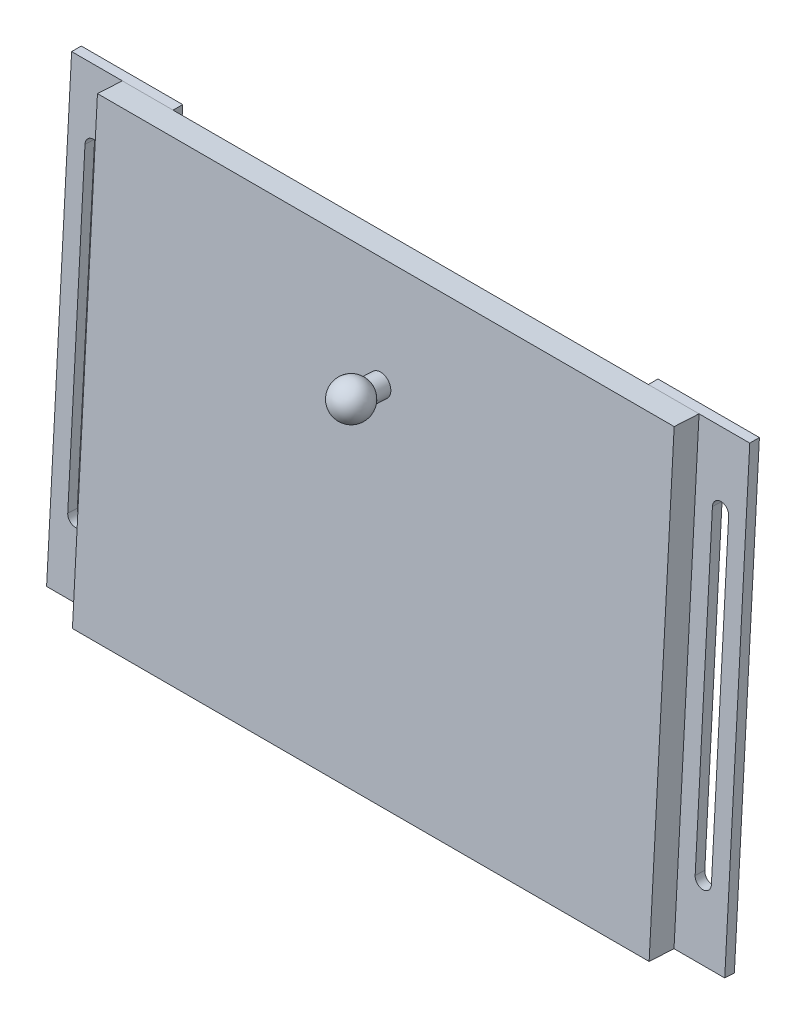
ISO-10303-21;
HEADER;
FILE_DESCRIPTION(('STEP AP214'),'2;1');
FILE_NAME('part.step','',(''),(''),'','','');
FILE_SCHEMA(('AUTOMOTIVE_DESIGN { 1 0 10303 214 1 1 1 1 }'));
ENDSEC;
DATA;
#1=APPLICATION_CONTEXT('core data for automotive mechanical design processes');
#2=APPLICATION_PROTOCOL_DEFINITION('international standard','automotive_design',2000,#1);
#3=PRODUCT_CONTEXT('',#1,'mechanical');
#4=PRODUCT('Part','Part','',(#3));
#5=PRODUCT_RELATED_PRODUCT_CATEGORY('part','',(#4));
#6=PRODUCT_DEFINITION_FORMATION('','',#4);
#7=PRODUCT_DEFINITION_CONTEXT('part definition',#1,'design');
#8=PRODUCT_DEFINITION('design','',#6,#7);
#9=PRODUCT_DEFINITION_SHAPE('','',#8);
#10=(LENGTH_UNIT() NAMED_UNIT(*) SI_UNIT(.MILLI.,.METRE.));
#11=(NAMED_UNIT(*) PLANE_ANGLE_UNIT() SI_UNIT($,.RADIAN.));
#12=(NAMED_UNIT(*) SI_UNIT($,.STERADIAN.) SOLID_ANGLE_UNIT());
#13=UNCERTAINTY_MEASURE_WITH_UNIT(LENGTH_MEASURE(1.E-05),#10,'distance_accuracy_value','');
#14=(GEOMETRIC_REPRESENTATION_CONTEXT(3) GLOBAL_UNCERTAINTY_ASSIGNED_CONTEXT((#13)) GLOBAL_UNIT_ASSIGNED_CONTEXT((#10,
#11,#12)) REPRESENTATION_CONTEXT('',''));
#15=CARTESIAN_POINT('',(0.,0.,0.));
#16=DIRECTION('',(0.,0.,1.));
#17=DIRECTION('',(1.,0.,0.));
#18=AXIS2_PLACEMENT_3D('',#15,#16,#17);
#19=CARTESIAN_POINT('',(123.7,45.7928784849479,-5.004980627655));
#20=DIRECTION('',(0.,0.055470019622522,0.998460353205412));
#21=DIRECTION('',(0.,-0.998460353205412,0.055470019622522));
#22=AXIS2_PLACEMENT_3D('',#19,#20,#21);
#23=PLANE('',#22);
#24=DIRECTION('',(0.,0.998460353205412,-0.055470019622522));
#25=VECTOR('',#24,1.);
#26=CARTESIAN_POINT('',(113.7,45.7928784849479,-5.004980627655));
#27=LINE('',#26,#25);
#28=CARTESIAN_POINT('',(113.7,-43.0700929503338,-0.0681488812505356));
#29=VERTEX_POINT('',#28);
#30=CARTESIAN_POINT('',(113.7,45.7928784849479,-5.004980627655));
#31=VERTEX_POINT('',#30);
#32=EDGE_CURVE('E322',#29,#31,#27,.T.);
#33=ORIENTED_EDGE('',*,*,#32,.F.);
#34=DIRECTION('',(-1.,0.,0.));
#35=VECTOR('',#34,1.);
#36=CARTESIAN_POINT('',(123.7,-43.0700929503338,-0.0681488812505356));
#37=LINE('',#36,#35);
#38=CARTESIAN_POINT('',(123.7,-43.0700929503338,-0.0681488812505356));
#39=VERTEX_POINT('',#38);
#40=EDGE_CURVE('E246',#39,#29,#37,.T.);
#41=ORIENTED_EDGE('',*,*,#40,.F.);
#42=DIRECTION('',(0.,0.998460353205412,-0.055470019622522));
#43=VECTOR('',#42,1.);
#44=CARTESIAN_POINT('',(123.7,45.7928784849479,-5.004980627655));
#45=LINE('',#44,#43);
#46=CARTESIAN_POINT('',(123.7,45.7928784849479,-5.004980627655));
#47=VERTEX_POINT('',#46);
#48=EDGE_CURVE('E218',#39,#47,#45,.T.);
#49=ORIENTED_EDGE('',*,*,#48,.T.);
#50=DIRECTION('',(-1.,0.,0.));
#51=VECTOR('',#50,1.);
#52=CARTESIAN_POINT('',(123.7,45.7928784849479,-5.004980627655));
#53=LINE('',#52,#51);
#54=EDGE_CURVE('E231',#47,#31,#53,.T.);
#55=ORIENTED_EDGE('',*,*,#54,.T.);
#56=EDGE_LOOP('',(#33,#41,#49,#55));
#57=FACE_BOUND('',#56,.T.);
#58=DIRECTION('',(0.,-0.998460353205412,0.055470019622522));
#59=VECTOR('',#58,1.);
#60=CARTESIAN_POINT('',(120.3,45.7928784849479,-5.004980627655));
#61=LINE('',#60,#59);
#62=CARTESIAN_POINT('',(120.3,32.0572209238698,-4.24188854092844));
#63=VERTEX_POINT('',#62);
#64=CARTESIAN_POINT('',(120.3,-29.2293289386864,-0.837080215230933));
#65=VERTEX_POINT('',#64);
#66=EDGE_CURVE('E211',#63,#65,#61,.T.);
#67=ORIENTED_EDGE('',*,*,#66,.T.);
#68=CARTESIAN_POINT('',(118.7,-29.2293289386864,-0.837080215230932));
#69=DIRECTION('',(0.,0.055470019622522,0.998460353205412));
#70=DIRECTION('',(0.,0.998460353205413,-0.055470019622522));
#71=AXIS2_PLACEMENT_3D('',#68,#69,#70);
#72=ELLIPSE('',#71,1.60000000344613,1.6);
#73=CARTESIAN_POINT('',(117.1,-29.2293289386864,-0.837080215230933));
#74=VERTEX_POINT('',#73);
#75=EDGE_CURVE('E214',#65,#74,#72,.F.);
#76=ORIENTED_EDGE('',*,*,#75,.T.);
#77=DIRECTION('',(0.,0.998460353205412,-0.055470019622522));
#78=VECTOR('',#77,1.);
#79=CARTESIAN_POINT('',(117.1,45.7928784849479,-5.004980627655));
#80=LINE('',#79,#78);
#81=CARTESIAN_POINT('',(117.1,32.0572209238698,-4.24188854092844));
#82=VERTEX_POINT('',#81);
#83=EDGE_CURVE('E206',#74,#82,#80,.T.);
#84=ORIENTED_EDGE('',*,*,#83,.T.);
#85=CARTESIAN_POINT('',(118.7,32.0572209238698,-4.24188854092844));
#86=DIRECTION('',(0.,0.055470019622522,0.998460353205412));
#87=DIRECTION('',(0.,0.998460353205413,-0.055470019622522));
#88=AXIS2_PLACEMENT_3D('',#85,#86,#87);
#89=ELLIPSE('',#88,1.60000000344613,1.6);
#90=EDGE_CURVE('E187',#82,#63,#89,.F.);
#91=ORIENTED_EDGE('',*,*,#90,.T.);
#92=EDGE_LOOP('',(#67,#76,#84,#91));
#93=FACE_BOUND('',#92,.T.);
#94=ADVANCED_FACE('F38',(#57,#93),#23,.T.);
#95=CARTESIAN_POINT('',(123.7,45.7928784849479,-6.904980627655));
#96=DIRECTION('',(0.,-0.0554044877329125,-0.998463991708791));
#97=DIRECTION('',(0.,0.998463991708792,-0.0554044877329125));
#98=AXIS2_PLACEMENT_3D('',#95,#96,#97);
#99=PLANE('',#98);
#100=DIRECTION('',(0.,-0.998463991708792,0.0554044877329125));
#101=VECTOR('',#100,1.);
#102=CARTESIAN_POINT('',(103.7,45.7928784849479,-6.904980627655));
#103=LINE('',#102,#101);
#104=CARTESIAN_POINT('',(103.7,45.7928784849479,-6.904980627655));
#105=VERTEX_POINT('',#104);
#106=CARTESIAN_POINT('',(103.7,-43.1755234191005,-1.96814888125054));
#107=VERTEX_POINT('',#106);
#108=EDGE_CURVE('E236',#105,#107,#103,.T.);
#109=ORIENTED_EDGE('',*,*,#108,.F.);
#110=DIRECTION('',(-1.,0.,0.));
#111=VECTOR('',#110,1.);
#112=CARTESIAN_POINT('',(123.7,45.7928784849479,-6.904980627655));
#113=LINE('',#112,#111);
#114=CARTESIAN_POINT('',(123.7,45.7928784849479,-6.904980627655));
#115=VERTEX_POINT('',#114);
#116=EDGE_CURVE('E242',#115,#105,#113,.T.);
#117=ORIENTED_EDGE('',*,*,#116,.F.);
#118=DIRECTION('',(0.,-0.998463991708792,0.0554044877329125));
#119=VECTOR('',#118,1.);
#120=CARTESIAN_POINT('',(123.7,45.7928784849479,-6.904980627655));
#121=LINE('',#120,#119);
#122=CARTESIAN_POINT('',(123.7,-43.1755234191005,-1.96814888125054));
#123=VERTEX_POINT('',#122);
#124=EDGE_CURVE('E225',#115,#123,#121,.T.);
#125=ORIENTED_EDGE('',*,*,#124,.T.);
#126=DIRECTION('',(-1.,0.,0.));
#127=VECTOR('',#126,1.);
#128=CARTESIAN_POINT('',(123.7,-43.1755234191005,-1.96814888125054));
#129=LINE('',#128,#127);
#130=EDGE_CURVE('E244',#123,#107,#129,.T.);
#131=ORIENTED_EDGE('',*,*,#130,.T.);
#132=EDGE_LOOP('',(#109,#117,#125,#131));
#133=FACE_BOUND('',#132,.T.);
#134=DIRECTION('',(0.,-0.998463991708791,0.0554044877329125));
#135=VECTOR('',#134,1.);
#136=CARTESIAN_POINT('',(117.1,-29.3347089999416,-2.7361718035268));
#137=LINE('',#136,#135);
#138=CARTESIAN_POINT('',(117.1,31.9520640657891,-6.13695770537874));
#139=VERTEX_POINT('',#138);
#140=CARTESIAN_POINT('',(117.1,-29.3347089999416,-2.7361718035268));
#141=VERTEX_POINT('',#140);
#142=EDGE_CURVE('E193',#139,#141,#137,.T.);
#143=ORIENTED_EDGE('',*,*,#142,.T.);
#144=CARTESIAN_POINT('',(118.7,-29.3347089999416,-2.7361718035268));
#145=DIRECTION('',(0.,0.0554044877329125,0.998463991708792));
#146=DIRECTION('',(0.,0.998463991708791,-0.0554044877329125));
#147=AXIS2_PLACEMENT_3D('',#144,#145,#146);
#148=CIRCLE('',#147,1.6);
#149=CARTESIAN_POINT('',(120.3,-29.3347089999416,-2.7361718035268));
#150=VERTEX_POINT('',#149);
#151=EDGE_CURVE('E67',#141,#150,#148,.T.);
#152=ORIENTED_EDGE('',*,*,#151,.T.);
#153=DIRECTION('',(0.,0.998463991708791,-0.0554044877329125));
#154=VECTOR('',#153,1.);
#155=CARTESIAN_POINT('',(120.3,-29.3347089999416,-2.7361718035268));
#156=LINE('',#155,#154);
#157=CARTESIAN_POINT('',(120.3,31.9520640657891,-6.13695770537874));
#158=VERTEX_POINT('',#157);
#159=EDGE_CURVE('E199',#150,#158,#156,.T.);
#160=ORIENTED_EDGE('',*,*,#159,.T.);
#161=CARTESIAN_POINT('',(118.7,31.9520640657891,-6.13695770537874));
#162=DIRECTION('',(0.,0.0554044877329125,0.998463991708792));
#163=DIRECTION('',(0.,0.998463991708791,-0.0554044877329125));
#164=AXIS2_PLACEMENT_3D('',#161,#162,#163);
#165=CIRCLE('',#164,1.6);
#166=EDGE_CURVE('E184',#158,#139,#165,.T.);
#167=ORIENTED_EDGE('',*,*,#166,.T.);
#168=EDGE_LOOP('',(#143,#152,#160,#167));
#169=FACE_BOUND('',#168,.T.);
#170=ADVANCED_FACE('F197',(#133,#169),#99,.T.);
#171=CARTESIAN_POINT('',(113.7,45.7928784849479,-5.004980627655));
#172=DIRECTION('',(0.,0.055470019622522,0.998460353205412));
#173=DIRECTION('',(0.,-0.998460353205413,0.055470019622522));
#174=AXIS2_PLACEMENT_3D('',#171,#172,#173);
#175=PLANE('',#174);
#176=DIRECTION('',(0.,0.998460353205412,-0.055470019622522));
#177=VECTOR('',#176,1.);
#178=CARTESIAN_POINT('',(103.7,45.7928784849479,-5.004980627655));
#179=LINE('',#178,#177);
#180=CARTESIAN_POINT('',(103.7,-43.0700929503338,-0.0681488812505356));
#181=VERTEX_POINT('',#180);
#182=CARTESIAN_POINT('',(103.7,45.7928784849479,-5.004980627655));
#183=VERTEX_POINT('',#182);
#184=EDGE_CURVE('E217',#181,#183,#179,.T.);
#185=ORIENTED_EDGE('',*,*,#184,.F.);
#186=DIRECTION('',(-1.,0.,0.));
#187=VECTOR('',#186,1.);
#188=CARTESIAN_POINT('',(113.7,-43.0700929503338,-0.0681488812505356));
#189=LINE('',#188,#187);
#190=CARTESIAN_POINT('',(9.99999999999999,-43.0700929503338,-0.0681488812505356));
#191=VERTEX_POINT('',#190);
#192=EDGE_CURVE('E342',#181,#191,#189,.T.);
#193=ORIENTED_EDGE('',*,*,#192,.T.);
#194=DIRECTION('',(0.,0.998460353205412,-0.055470019622522));
#195=VECTOR('',#194,1.);
#196=CARTESIAN_POINT('',(10.,45.7928784849479,-5.004980627655));
#197=LINE('',#196,#195);
#198=CARTESIAN_POINT('',(9.99999999999999,45.7928784849479,-5.004980627655));
#199=VERTEX_POINT('',#198);
#200=EDGE_CURVE('E281',#191,#199,#197,.T.);
#201=ORIENTED_EDGE('',*,*,#200,.T.);
#202=DIRECTION('',(-1.,0.,0.));
#203=VECTOR('',#202,1.);
#204=CARTESIAN_POINT('',(113.7,45.7928784849479,-5.004980627655));
#205=LINE('',#204,#203);
#206=EDGE_CURVE('E338',#183,#199,#205,.T.);
#207=ORIENTED_EDGE('',*,*,#206,.F.);
#208=EDGE_LOOP('',(#185,#193,#201,#207));
#209=FACE_BOUND('',#208,.T.);
#210=ADVANCED_FACE('F385',(#209),#175,.F.);
#211=CARTESIAN_POINT('',(113.7,-42.7974974253317,4.83857056878749));
#212=DIRECTION('',(0.,-0.0554700196225224,-0.998460353205412));
#213=DIRECTION('',(0.,0.998460353205413,-0.0554700196225224));
#214=AXIS2_PLACEMENT_3D('',#211,#212,#213);
#215=PLANE('',#214);
#216=CARTESIAN_POINT('',(56.8495,25.3319908849635,1.05359899599335));
#217=DIRECTION('',(0.,-0.0554700196225224,-0.998460353205412));
#218=DIRECTION('',(0.,0.998460353205413,-0.0554700196225224));
#219=AXIS2_PLACEMENT_3D('',#216,#217,#218);
#220=CIRCLE('',#219,2.13542992135034);
#221=CARTESIAN_POINT('',(56.8495,27.4641329984804,0.935146656353525));
#222=VERTEX_POINT('',#221);
#223=EDGE_CURVE('E11',#222,#222,#220,.F.);
#224=ORIENTED_EDGE('',*,*,#223,.F.);
#225=EDGE_LOOP('',(#224));
#226=FACE_BOUND('',#225,.T.);
#227=DIRECTION('',(0.,-0.998460353205412,0.0554700196225224));
#228=VECTOR('',#227,1.);
#229=CARTESIAN_POINT('',(0.,-42.7974974253317,4.83857056878749));
#230=LINE('',#229,#228);
#231=CARTESIAN_POINT('',(0.,46.06547400995,-0.0982611776170001));
#232=VERTEX_POINT('',#231);
#233=CARTESIAN_POINT('',(0.,-42.7974974253317,4.83857056878749));
#234=VERTEX_POINT('',#233);
#235=EDGE_CURVE('E314',#232,#234,#230,.T.);
#236=ORIENTED_EDGE('',*,*,#235,.T.);
#237=DIRECTION('',(-1.,0.,0.));
#238=VECTOR('',#237,1.);
#239=CARTESIAN_POINT('',(113.7,-42.7974974253317,4.83857056878749));
#240=LINE('',#239,#238);
#241=CARTESIAN_POINT('',(113.7,-42.7974974253317,4.83857056878749));
#242=VERTEX_POINT('',#241);
#243=EDGE_CURVE('E52',#242,#234,#240,.T.);
#244=ORIENTED_EDGE('',*,*,#243,.F.);
#245=DIRECTION('',(0.,-0.998460353205412,0.0554700196225224));
#246=VECTOR('',#245,1.);
#247=CARTESIAN_POINT('',(113.7,-42.7974974253317,4.83857056878749));
#248=LINE('',#247,#246);
#249=CARTESIAN_POINT('',(113.7,46.06547400995,-0.0982611776170001));
#250=VERTEX_POINT('',#249);
#251=EDGE_CURVE('E315',#250,#242,#248,.T.);
#252=ORIENTED_EDGE('',*,*,#251,.F.);
#253=DIRECTION('',(-1.,0.,0.));
#254=VECTOR('',#253,1.);
#255=CARTESIAN_POINT('',(113.7,46.06547400995,-0.0982611776170001));
#256=LINE('',#255,#254);
#257=EDGE_CURVE('E327',#250,#232,#256,.T.);
#258=ORIENTED_EDGE('',*,*,#257,.T.);
#259=EDGE_LOOP('',(#236,#244,#252,#258));
#260=FACE_BOUND('',#259,.T.);
#261=ADVANCED_FACE('F40',(#226,#260),#215,.F.);
#262=CARTESIAN_POINT('',(113.7,-43.0700929503338,-0.0681488812505356));
#263=DIRECTION('',(0.,0.998460353205412,-0.0554700196225227));
#264=DIRECTION('',(0.,0.0554700196225227,0.998460353205413));
#265=AXIS2_PLACEMENT_3D('',#262,#263,#264);
#266=PLANE('',#265);
#267=DIRECTION('',(0.,-0.0554700196225227,-0.998460353205412));
#268=VECTOR('',#267,1.);
#269=CARTESIAN_POINT('',(0.,-43.0700929503338,-0.0681488812505356));
#270=LINE('',#269,#268);
#271=CARTESIAN_POINT('',(0.,-43.0700929503338,-0.0681488812505356));
#272=VERTEX_POINT('',#271);
#273=EDGE_CURVE('E330',#234,#272,#270,.T.);
#274=ORIENTED_EDGE('',*,*,#273,.T.);
#275=DIRECTION('',(1.,0.,0.));
#276=VECTOR('',#275,1.);
#277=CARTESIAN_POINT('',(-10.,-43.0700929503338,-0.0681488812505356));
#278=LINE('',#277,#276);
#279=EDGE_CURVE('E292',#272,#191,#278,.T.);
#280=ORIENTED_EDGE('',*,*,#279,.T.);
#281=ORIENTED_EDGE('',*,*,#192,.F.);
#282=EDGE_CURVE('E343',#29,#181,#189,.T.);
#283=ORIENTED_EDGE('',*,*,#282,.F.);
#284=DIRECTION('',(0.,-0.0554700196225227,-0.998460353205412));
#285=VECTOR('',#284,1.);
#286=CARTESIAN_POINT('',(113.7,-43.0700929503338,-0.0681488812505356));
#287=LINE('',#286,#285);
#288=EDGE_CURVE('E318',#242,#29,#287,.T.);
#289=ORIENTED_EDGE('',*,*,#288,.F.);
#290=ORIENTED_EDGE('',*,*,#243,.T.);
#291=EDGE_LOOP('',(#274,#280,#281,#283,#289,#290));
#292=FACE_BOUND('',#291,.T.);
#293=ADVANCED_FACE('F348',(#292),#266,.F.);
#294=CARTESIAN_POINT('',(113.7,46.06547400995,-0.0982611776170001));
#295=DIRECTION('',(0.,-0.998460353205412,0.0554700196225217));
#296=DIRECTION('',(0.,-0.0554700196225217,-0.998460353205412));
#297=AXIS2_PLACEMENT_3D('',#294,#295,#296);
#298=PLANE('',#297);
#299=DIRECTION('',(0.,0.0554700196225217,0.998460353205413));
#300=VECTOR('',#299,1.);
#301=CARTESIAN_POINT('',(0.,46.06547400995,-0.0982611776170001));
#302=LINE('',#301,#300);
#303=CARTESIAN_POINT('',(0.,45.7928784849479,-5.004980627655));
#304=VERTEX_POINT('',#303);
#305=EDGE_CURVE('E319',#304,#232,#302,.T.);
#306=ORIENTED_EDGE('',*,*,#305,.T.);
#307=ORIENTED_EDGE('',*,*,#257,.F.);
#308=DIRECTION('',(0.,0.0554700196225217,0.998460353205413));
#309=VECTOR('',#308,1.);
#310=CARTESIAN_POINT('',(113.7,46.06547400995,-0.0982611776170001));
#311=LINE('',#310,#309);
#312=EDGE_CURVE('E325',#31,#250,#311,.T.);
#313=ORIENTED_EDGE('',*,*,#312,.F.);
#314=EDGE_CURVE('E339',#31,#183,#205,.T.);
#315=ORIENTED_EDGE('',*,*,#314,.T.);
#316=ORIENTED_EDGE('',*,*,#206,.T.);
#317=DIRECTION('',(1.,0.,0.));
#318=VECTOR('',#317,1.);
#319=CARTESIAN_POINT('',(-10.,45.7928784849479,-5.004980627655));
#320=LINE('',#319,#318);
#321=EDGE_CURVE('E310',#304,#199,#320,.T.);
#322=ORIENTED_EDGE('',*,*,#321,.F.);
#323=EDGE_LOOP('',(#306,#307,#313,#315,#316,#322));
#324=FACE_BOUND('',#323,.T.);
#325=ADVANCED_FACE('F389',(#324),#298,.F.);
#326=CARTESIAN_POINT('',(113.7,0.,0.));
#327=DIRECTION('',(-1.,0.,0.));
#328=DIRECTION('',(0.,0.,1.));
#329=AXIS2_PLACEMENT_3D('',#326,#327,#328);
#330=PLANE('',#329);
#331=ORIENTED_EDGE('',*,*,#251,.T.);
#332=ORIENTED_EDGE('',*,*,#288,.T.);
#333=ORIENTED_EDGE('',*,*,#32,.T.);
#334=ORIENTED_EDGE('',*,*,#312,.T.);
#335=EDGE_LOOP('',(#331,#332,#333,#334));
#336=FACE_BOUND('',#335,.T.);
#337=ADVANCED_FACE('F396',(#336),#330,.F.);
#338=CARTESIAN_POINT('',(0.,0.,0.));
#339=DIRECTION('',(-1.,0.,0.));
#340=DIRECTION('',(0.,0.,1.));
#341=AXIS2_PLACEMENT_3D('',#338,#339,#340);
#342=PLANE('',#341);
#343=ORIENTED_EDGE('',*,*,#235,.F.);
#344=ORIENTED_EDGE('',*,*,#305,.F.);
#345=DIRECTION('',(0.,0.998460353205412,-0.055470019622522));
#346=VECTOR('',#345,1.);
#347=CARTESIAN_POINT('',(0.,45.7928784849479,-5.004980627655));
#348=LINE('',#347,#346);
#349=EDGE_CURVE('E332',#272,#304,#348,.T.);
#350=ORIENTED_EDGE('',*,*,#349,.F.);
#351=ORIENTED_EDGE('',*,*,#273,.F.);
#352=EDGE_LOOP('',(#343,#344,#350,#351));
#353=FACE_BOUND('',#352,.T.);
#354=ADVANCED_FACE('F357',(#353),#342,.T.);
#355=CARTESIAN_POINT('',(-10.,45.7928784849479,-5.004980627655));
#356=DIRECTION('',(0.,-0.055470019622522,-0.998460353205412));
#357=DIRECTION('',(0.,0.998460353205412,-0.055470019622522));
#358=AXIS2_PLACEMENT_3D('',#355,#356,#357);
#359=PLANE('',#358);
#360=DIRECTION('',(0.,-0.998460353205412,0.055470019622522));
#361=VECTOR('',#360,1.);
#362=CARTESIAN_POINT('',(-3.39999999999998,45.7928784849479,-5.004980627655));
#363=LINE('',#362,#361);
#364=CARTESIAN_POINT('',(-3.39999999999998,32.0572209238698,-4.24188854092844));
#365=VERTEX_POINT('',#364);
#366=CARTESIAN_POINT('',(-3.40000000000001,-29.2293289386864,-0.837080215230933));
#367=VERTEX_POINT('',#366);
#368=EDGE_CURVE('E275',#365,#367,#363,.T.);
#369=ORIENTED_EDGE('',*,*,#368,.T.);
#370=CARTESIAN_POINT('',(-5.,-29.2293289386864,-0.837080215230932));
#371=DIRECTION('',(0.,-0.055470019622522,-0.998460353205412));
#372=DIRECTION('',(0.,0.998460353205413,-0.055470019622522));
#373=AXIS2_PLACEMENT_3D('',#370,#371,#372);
#374=ELLIPSE('',#373,1.60000000344613,1.6);
#375=CARTESIAN_POINT('',(-6.60000000000001,-29.2293289386864,-0.837080215230933));
#376=VERTEX_POINT('',#375);
#377=EDGE_CURVE('E278',#367,#376,#374,.T.);
#378=ORIENTED_EDGE('',*,*,#377,.T.);
#379=DIRECTION('',(0.,0.998460353205412,-0.055470019622522));
#380=VECTOR('',#379,1.);
#381=CARTESIAN_POINT('',(-6.59999999999998,45.7928784849479,-5.004980627655));
#382=LINE('',#381,#380);
#383=CARTESIAN_POINT('',(-6.59999999999998,32.0572209238698,-4.24188854092844));
#384=VERTEX_POINT('',#383);
#385=EDGE_CURVE('E263',#376,#384,#382,.T.);
#386=ORIENTED_EDGE('',*,*,#385,.T.);
#387=CARTESIAN_POINT('',(-4.99999999999998,32.0572209238698,-4.24188854092844));
#388=DIRECTION('',(0.,-0.055470019622522,-0.998460353205412));
#389=DIRECTION('',(0.,0.998460353205413,-0.055470019622522));
#390=AXIS2_PLACEMENT_3D('',#387,#388,#389);
#391=ELLIPSE('',#390,1.60000000344613,1.6);
#392=EDGE_CURVE('E272',#384,#365,#391,.T.);
#393=ORIENTED_EDGE('',*,*,#392,.T.);
#394=EDGE_LOOP('',(#369,#378,#386,#393));
#395=FACE_BOUND('',#394,.T.);
#396=ORIENTED_EDGE('',*,*,#349,.T.);
#397=CARTESIAN_POINT('',(-10.,45.7928784849479,-5.004980627655));
#398=VERTEX_POINT('',#397);
#399=EDGE_CURVE('E311',#398,#304,#320,.T.);
#400=ORIENTED_EDGE('',*,*,#399,.F.);
#401=DIRECTION('',(0.,0.998460353205412,-0.055470019622522));
#402=VECTOR('',#401,1.);
#403=CARTESIAN_POINT('',(-10.,45.7928784849479,-5.004980627655));
#404=LINE('',#403,#402);
#405=CARTESIAN_POINT('',(-10.,-43.0700929503338,-0.0681488812505356));
#406=VERTEX_POINT('',#405);
#407=EDGE_CURVE('E282',#406,#398,#404,.T.);
#408=ORIENTED_EDGE('',*,*,#407,.F.);
#409=EDGE_CURVE('E301',#406,#272,#278,.T.);
#410=ORIENTED_EDGE('',*,*,#409,.T.);
#411=EDGE_LOOP('',(#396,#400,#408,#410));
#412=FACE_BOUND('',#411,.T.);
#413=ADVANCED_FACE('F370',(#395,#412),#359,.F.);
#414=CARTESIAN_POINT('',(-10.,45.7928784849479,-5.004980627655));
#415=DIRECTION('',(0.,-1.,0.));
#416=DIRECTION('',(0.,0.,-1.));
#417=AXIS2_PLACEMENT_3D('',#414,#415,#416);
#418=PLANE('',#417);
#419=DIRECTION('',(0.,0.,-1.));
#420=VECTOR('',#419,1.);
#421=CARTESIAN_POINT('',(10.,45.7928784849479,-5.004980627655));
#422=LINE('',#421,#420);
#423=CARTESIAN_POINT('',(10.,45.7928784849479,-6.904980627655));
#424=VERTEX_POINT('',#423);
#425=EDGE_CURVE('E295',#199,#424,#422,.T.);
#426=ORIENTED_EDGE('',*,*,#425,.T.);
#427=DIRECTION('',(1.,0.,0.));
#428=VECTOR('',#427,1.);
#429=CARTESIAN_POINT('',(-10.,45.7928784849479,-6.904980627655));
#430=LINE('',#429,#428);
#431=CARTESIAN_POINT('',(-10.,45.7928784849479,-6.904980627655));
#432=VERTEX_POINT('',#431);
#433=EDGE_CURVE('E307',#432,#424,#430,.T.);
#434=ORIENTED_EDGE('',*,*,#433,.F.);
#435=DIRECTION('',(0.,0.,-1.));
#436=VECTOR('',#435,1.);
#437=CARTESIAN_POINT('',(-10.,45.7928784849479,-5.004980627655));
#438=LINE('',#437,#436);
#439=EDGE_CURVE('E285',#398,#432,#438,.T.);
#440=ORIENTED_EDGE('',*,*,#439,.F.);
#441=ORIENTED_EDGE('',*,*,#399,.T.);
#442=ORIENTED_EDGE('',*,*,#321,.T.);
#443=EDGE_LOOP('',(#426,#434,#440,#441,#442));
#444=FACE_BOUND('',#443,.T.);
#445=ADVANCED_FACE('F387',(#444),#418,.F.);
#446=CARTESIAN_POINT('',(-10.,45.7928784849479,-6.904980627655));
#447=DIRECTION('',(0.,0.0554044877329125,0.998463991708791));
#448=DIRECTION('',(0.,-0.998463991708792,0.0554044877329125));
#449=AXIS2_PLACEMENT_3D('',#446,#447,#448);
#450=PLANE('',#449);
#451=DIRECTION('',(0.,0.998463991708791,-0.0554044877329125));
#452=VECTOR('',#451,1.);
#453=CARTESIAN_POINT('',(-6.60000000000001,-29.3347089999416,-2.7361718035268));
#454=LINE('',#453,#452);
#455=CARTESIAN_POINT('',(-6.60000000000001,-29.3347089999416,-2.7361718035268));
#456=VERTEX_POINT('',#455);
#457=CARTESIAN_POINT('',(-6.59999999999998,31.9520640657891,-6.13695770537874));
#458=VERTEX_POINT('',#457);
#459=EDGE_CURVE('E251',#456,#458,#454,.T.);
#460=ORIENTED_EDGE('',*,*,#459,.F.);
#461=CARTESIAN_POINT('',(-5.,-29.3347089999416,-2.7361718035268));
#462=DIRECTION('',(0.,-0.0554044877329125,-0.998463991708792));
#463=DIRECTION('',(0.,0.998463991708791,-0.0554044877329125));
#464=AXIS2_PLACEMENT_3D('',#461,#462,#463);
#465=CIRCLE('',#464,1.6);
#466=CARTESIAN_POINT('',(-3.40000000000001,-29.3347089999416,-2.7361718035268));
#467=VERTEX_POINT('',#466);
#468=EDGE_CURVE('E249',#467,#456,#465,.T.);
#469=ORIENTED_EDGE('',*,*,#468,.F.);
#470=DIRECTION('',(0.,-0.998463991708791,0.0554044877329125));
#471=VECTOR('',#470,1.);
#472=CARTESIAN_POINT('',(-3.40000000000001,-29.3347089999416,-2.7361718035268));
#473=LINE('',#472,#471);
#474=CARTESIAN_POINT('',(-3.39999999999998,31.9520640657891,-6.13695770537874));
#475=VERTEX_POINT('',#474);
#476=EDGE_CURVE('E257',#475,#467,#473,.T.);
#477=ORIENTED_EDGE('',*,*,#476,.F.);
#478=CARTESIAN_POINT('',(-4.99999999999998,31.9520640657891,-6.13695770537874));
#479=DIRECTION('',(0.,-0.0554044877329125,-0.998463991708792));
#480=DIRECTION('',(0.,0.998463991708791,-0.0554044877329125));
#481=AXIS2_PLACEMENT_3D('',#478,#479,#480);
#482=CIRCLE('',#481,1.6);
#483=EDGE_CURVE('E254',#458,#475,#482,.T.);
#484=ORIENTED_EDGE('',*,*,#483,.F.);
#485=EDGE_LOOP('',(#460,#469,#477,#484));
#486=FACE_BOUND('',#485,.T.);
#487=DIRECTION('',(0.,-0.998463991708792,0.0554044877329125));
#488=VECTOR('',#487,1.);
#489=CARTESIAN_POINT('',(10.,45.7928784849479,-6.904980627655));
#490=LINE('',#489,#488);
#491=CARTESIAN_POINT('',(10.,-43.1755234191005,-1.96814888125054));
#492=VERTEX_POINT('',#491);
#493=EDGE_CURVE('E297',#424,#492,#490,.T.);
#494=ORIENTED_EDGE('',*,*,#493,.T.);
#495=DIRECTION('',(1.,0.,0.));
#496=VECTOR('',#495,1.);
#497=CARTESIAN_POINT('',(-10.,-43.1755234191005,-1.96814888125054));
#498=LINE('',#497,#496);
#499=CARTESIAN_POINT('',(-10.,-43.1755234191005,-1.96814888125054));
#500=VERTEX_POINT('',#499);
#501=EDGE_CURVE('E304',#500,#492,#498,.T.);
#502=ORIENTED_EDGE('',*,*,#501,.F.);
#503=DIRECTION('',(0.,-0.998463991708792,0.0554044877329125));
#504=VECTOR('',#503,1.);
#505=CARTESIAN_POINT('',(-10.,45.7928784849479,-6.904980627655));
#506=LINE('',#505,#504);
#507=EDGE_CURVE('E288',#432,#500,#506,.T.);
#508=ORIENTED_EDGE('',*,*,#507,.F.);
#509=ORIENTED_EDGE('',*,*,#433,.T.);
#510=EDGE_LOOP('',(#494,#502,#508,#509));
#511=FACE_BOUND('',#510,.T.);
#512=ADVANCED_FACE('F461',(#486,#511),#450,.F.);
#513=CARTESIAN_POINT('',(-10.,-43.1755234191005,-1.96814888125054));
#514=DIRECTION('',(0.,0.998463991708791,-0.0554044877329147));
#515=DIRECTION('',(0.,0.0554044877329147,0.998463991708791));
#516=AXIS2_PLACEMENT_3D('',#513,#514,#515);
#517=PLANE('',#516);
#518=DIRECTION('',(0.,0.0554044877329147,0.998463991708791));
#519=VECTOR('',#518,1.);
#520=CARTESIAN_POINT('',(10.,-43.1755234191005,-1.96814888125054));
#521=LINE('',#520,#519);
#522=EDGE_CURVE('E286',#492,#191,#521,.T.);
#523=ORIENTED_EDGE('',*,*,#522,.T.);
#524=ORIENTED_EDGE('',*,*,#279,.F.);
#525=ORIENTED_EDGE('',*,*,#409,.F.);
#526=DIRECTION('',(0.,0.0554044877329147,0.998463991708791));
#527=VECTOR('',#526,1.);
#528=CARTESIAN_POINT('',(-10.,-43.1755234191005,-1.96814888125054));
#529=LINE('',#528,#527);
#530=EDGE_CURVE('E290',#500,#406,#529,.T.);
#531=ORIENTED_EDGE('',*,*,#530,.F.);
#532=ORIENTED_EDGE('',*,*,#501,.T.);
#533=EDGE_LOOP('',(#523,#524,#525,#531,#532));
#534=FACE_BOUND('',#533,.T.);
#535=ADVANCED_FACE('F364',(#534),#517,.F.);
#536=CARTESIAN_POINT('',(-10.,0.,0.));
#537=DIRECTION('',(-1.,0.,0.));
#538=DIRECTION('',(0.,0.,1.));
#539=AXIS2_PLACEMENT_3D('',#536,#537,#538);
#540=PLANE('',#539);
#541=ORIENTED_EDGE('',*,*,#407,.T.);
#542=ORIENTED_EDGE('',*,*,#439,.T.);
#543=ORIENTED_EDGE('',*,*,#507,.T.);
#544=ORIENTED_EDGE('',*,*,#530,.T.);
#545=EDGE_LOOP('',(#541,#542,#543,#544));
#546=FACE_BOUND('',#545,.T.);
#547=ADVANCED_FACE('F372',(#546),#540,.T.);
#548=CARTESIAN_POINT('',(10.,0.,0.));
#549=DIRECTION('',(-1.,0.,0.));
#550=DIRECTION('',(0.,0.,1.));
#551=AXIS2_PLACEMENT_3D('',#548,#549,#550);
#552=PLANE('',#551);
#553=ORIENTED_EDGE('',*,*,#200,.F.);
#554=ORIENTED_EDGE('',*,*,#522,.F.);
#555=ORIENTED_EDGE('',*,*,#493,.F.);
#556=ORIENTED_EDGE('',*,*,#425,.F.);
#557=EDGE_LOOP('',(#553,#554,#555,#556));
#558=FACE_BOUND('',#557,.T.);
#559=ADVANCED_FACE('F379',(#558),#552,.F.);
#560=CARTESIAN_POINT('',(-5.,-28.7806641226125,7.24846811356112));
#561=DIRECTION('',(0.,-0.0554044877329125,-0.998463991708791));
#562=DIRECTION('',(0.,0.998463991708792,-0.0554044877329125));
#563=AXIS2_PLACEMENT_3D('',#560,#561,#562);
#564=CYLINDRICAL_SURFACE('',#563,1.6);
#565=DIRECTION('',(0.,-0.0554044877329125,-0.998463991708791));
#566=VECTOR('',#565,1.);
#567=CARTESIAN_POINT('',(-3.40000000000001,-28.7806641226125,7.24846811356112));
#568=LINE('',#567,#566);
#569=EDGE_CURVE('E261',#367,#467,#568,.T.);
#570=ORIENTED_EDGE('',*,*,#569,.T.);
#571=ORIENTED_EDGE('',*,*,#468,.T.);
#572=DIRECTION('',(0.,-0.0554044877329125,-0.998463991708791));
#573=VECTOR('',#572,1.);
#574=CARTESIAN_POINT('',(-6.60000000000001,-28.7806641226125,7.24846811356112));
#575=LINE('',#574,#573);
#576=EDGE_CURVE('E260',#376,#456,#575,.T.);
#577=ORIENTED_EDGE('',*,*,#576,.F.);
#578=ORIENTED_EDGE('',*,*,#377,.F.);
#579=EDGE_LOOP('',(#570,#571,#577,#578));
#580=FACE_BOUND('',#579,.T.);
#581=ADVANCED_FACE('F444',(#580),#564,.F.);
#582=CARTESIAN_POINT('',(-3.40000000000001,-28.7806641226125,7.24846811356112));
#583=DIRECTION('',(1.,0.,0.));
#584=DIRECTION('',(0.,1.,0.));
#585=AXIS2_PLACEMENT_3D('',#582,#583,#584);
#586=PLANE('',#585);
#587=DIRECTION('',(0.,-0.0554044877329125,-0.998463991708791));
#588=VECTOR('',#587,1.);
#589=CARTESIAN_POINT('',(-3.39999999999998,32.5061089431182,3.84768221170918));
#590=LINE('',#589,#588);
#591=EDGE_CURVE('E264',#365,#475,#590,.T.);
#592=ORIENTED_EDGE('',*,*,#591,.T.);
#593=ORIENTED_EDGE('',*,*,#476,.T.);
#594=ORIENTED_EDGE('',*,*,#569,.F.);
#595=ORIENTED_EDGE('',*,*,#368,.F.);
#596=EDGE_LOOP('',(#592,#593,#594,#595));
#597=FACE_BOUND('',#596,.T.);
#598=ADVANCED_FACE('F440',(#597),#586,.F.);
#599=CARTESIAN_POINT('',(-4.99999999999998,32.5061089431182,3.84768221170918));
#600=DIRECTION('',(0.,-0.0554044877329125,-0.998463991708791));
#601=DIRECTION('',(0.,0.998463991708792,-0.0554044877329125));
#602=AXIS2_PLACEMENT_3D('',#599,#600,#601);
#603=CYLINDRICAL_SURFACE('',#602,1.6);
#604=DIRECTION('',(0.,-0.0554044877329125,-0.998463991708791));
#605=VECTOR('',#604,1.);
#606=CARTESIAN_POINT('',(-6.59999999999998,32.5061089431182,3.84768221170918));
#607=LINE('',#606,#605);
#608=EDGE_CURVE('E266',#384,#458,#607,.T.);
#609=ORIENTED_EDGE('',*,*,#608,.T.);
#610=ORIENTED_EDGE('',*,*,#483,.T.);
#611=ORIENTED_EDGE('',*,*,#591,.F.);
#612=ORIENTED_EDGE('',*,*,#392,.F.);
#613=EDGE_LOOP('',(#609,#610,#611,#612));
#614=FACE_BOUND('',#613,.T.);
#615=ADVANCED_FACE('F443',(#614),#603,.F.);
#616=CARTESIAN_POINT('',(-6.60000000000001,-28.7806641226125,7.24846811356112));
#617=DIRECTION('',(-1.,0.,0.));
#618=DIRECTION('',(0.,-1.,0.));
#619=AXIS2_PLACEMENT_3D('',#616,#617,#618);
#620=PLANE('',#619);
#621=ORIENTED_EDGE('',*,*,#576,.T.);
#622=ORIENTED_EDGE('',*,*,#459,.T.);
#623=ORIENTED_EDGE('',*,*,#608,.F.);
#624=ORIENTED_EDGE('',*,*,#385,.F.);
#625=EDGE_LOOP('',(#621,#622,#623,#624));
#626=FACE_BOUND('',#625,.T.);
#627=ADVANCED_FACE('F438',(#626),#620,.F.);
#628=CARTESIAN_POINT('',(56.8495,25.7757510419437,9.04128182163665));
#629=DIRECTION('',(0.,-0.0554700196225224,-0.998460353205412));
#630=DIRECTION('',(0.,0.998460353205412,-0.0554700196225224));
#631=AXIS2_PLACEMENT_3D('',#628,#629,#630);
#632=CYLINDRICAL_SURFACE('',#631,2.13542992135034);
#633=CARTESIAN_POINT('',(55.7117389633461,23.6870096969492,4.02164856652046));
#634=CARTESIAN_POINT('',(55.6102207922026,23.7507223047804,4.01608291561769));
#635=CARTESIAN_POINT('',(55.5140314840759,23.8230253113979,4.00976563601602));
#636=CARTESIAN_POINT('',(55.3351268018445,23.9827570926799,3.99581110375811));
#637=CARTESIAN_POINT('',(55.2524278715273,24.0702040631157,3.98817226323154));
#638=CARTESIAN_POINT('',(55.1029761528639,24.2576537784757,3.97180297591978));
#639=CARTESIAN_POINT('',(55.0362154389206,24.3576502450096,3.96307307499045));
#640=CARTESIAN_POINT('',(54.9205060455457,24.5673599898733,3.9447730070966));
#641=CARTESIAN_POINT('',(54.8715529465535,24.6770708488328,3.93520304935341));
#642=CARTESIAN_POINT('',(54.7927985395042,24.9031717582492,3.91549057922031));
#643=CARTESIAN_POINT('',(54.7630058667012,25.0195647945375,3.90534781091204));
#644=CARTESIAN_POINT('',(54.7234506392952,25.2556867152277,3.88478277829081));
#645=CARTESIAN_POINT('',(54.7136889127009,25.3754157373201,3.87436050244204));
#646=CARTESIAN_POINT('',(54.7144741708961,25.6148422562909,3.85353005508472));
#647=CARTESIAN_POINT('',(54.7250268250846,25.7345397350417,3.84312188832503));
#648=CARTESIAN_POINT('',(54.7661536827743,25.9704715696045,3.82261728081579));
#649=CARTESIAN_POINT('',(54.7967278552301,26.086705930786,3.81252083958291));
#650=CARTESIAN_POINT('',(54.8770319926468,26.3124104452246,3.79292449783823));
#651=CARTESIAN_POINT('',(54.9267618535253,26.4218806352309,3.78342459408547));
#652=CARTESIAN_POINT('',(55.0439685006461,26.6309465422577,3.76528840418552));
#653=CARTESIAN_POINT('',(55.1114452323957,26.7305422895969,3.75665211538668));
#654=CARTESIAN_POINT('',(55.2622098413715,26.9169992813483,3.7404877313683));
#655=CARTESIAN_POINT('',(55.345492995907,27.0038643157778,3.73295930632768));
#656=CARTESIAN_POINT('',(55.5255212709608,27.1624240566701,3.7192181288477));
#657=CARTESIAN_POINT('',(55.6222663739792,27.2341187828534,3.71300537469806));
#658=CARTESIAN_POINT('',(55.8264251601237,27.3602675817146,3.70207150053446));
#659=CARTESIAN_POINT('',(55.9338339766755,27.4147294718189,3.69734970417112));
#660=CARTESIAN_POINT('',(56.1563074168002,27.5049061307285,3.68952547610659));
#661=CARTESIAN_POINT('',(56.2713720184787,27.5406209531449,3.6864230397745));
#662=CARTESIAN_POINT('',(56.5058394573536,27.5922752559494,3.68192482167164));
#663=CARTESIAN_POINT('',(56.6252404760017,27.6082229296658,3.68052833280247));
#664=CARTESIAN_POINT('',(56.8650352031619,27.6199158720747,3.67947847538077));
#665=CARTESIAN_POINT('',(56.9854289102885,27.6156611689582,3.67982510439585));
#666=CARTESIAN_POINT('',(57.2237655599525,27.587073471728,3.68225156566473));
#667=CARTESIAN_POINT('',(57.3417089965574,27.5627445664201,3.6843310449645));
#668=CARTESIAN_POINT('',(57.571822997065,27.494706262212,3.69016490767079));
#669=CARTESIAN_POINT('',(57.6839935611054,27.4509968637743,3.69391929103736));
#670=CARTESIAN_POINT('',(57.8993895477438,27.3454363182958,3.70299891230617));
#671=CARTESIAN_POINT('',(58.0026141598474,27.2835835297033,3.70832429234704));
#672=CARTESIAN_POINT('',(58.197180363257,27.143496482583,3.72039746608784));
#673=CARTESIAN_POINT('',(58.2885219354286,27.0652621976779,3.72714526207813));
#674=CARTESIAN_POINT('',(58.4567639331074,26.8946050260199,3.74187766884428));
#675=CARTESIAN_POINT('',(58.5336593255394,26.8021772145244,3.74986270891668));
#676=CARTESIAN_POINT('',(58.6707921496796,26.6057780237803,3.76684469677645));
#677=CARTESIAN_POINT('',(58.7310295422843,26.5018066174346,3.77584164693913));
#678=CARTESIAN_POINT('',(58.8331657446656,26.285220468438,3.79459973928499));
#679=CARTESIAN_POINT('',(58.875056070279,26.1726017552777,3.80436123255855));
#680=CARTESIAN_POINT('',(58.939272395186,25.9419592605986,3.82437029176672));
#681=CARTESIAN_POINT('',(58.9615983403355,25.8239354641222,3.83461785904646));
#682=CARTESIAN_POINT('',(58.9860592949874,25.5857850251699,3.85531389007094));
#683=CARTESIAN_POINT('',(58.9881865862017,25.4656575964209,3.86576242908277));
#684=CARTESIAN_POINT('',(58.9721701501837,25.2267531323895,3.88656041187172));
#685=CARTESIAN_POINT('',(58.9540264197947,25.1079760973175,3.89690985563342));
#686=CARTESIAN_POINT('',(58.8979778980494,24.8751278213887,3.9172163666275));
#687=CARTESIAN_POINT('',(58.8600704873946,24.7610572064409,3.92717338166277));
#688=CARTESIAN_POINT('',(58.7655665816545,24.5408778947442,3.94640872905693));
#689=CARTESIAN_POINT('',(58.7089700625992,24.434769208207,3.95568706054535));
#690=CARTESIAN_POINT('',(58.578703981876,24.233548135215,3.97329665022018));
#691=CARTESIAN_POINT('',(58.5050375930471,24.1384337101348,3.98162808398152));
#692=CARTESIAN_POINT('',(58.3427144426039,23.9618827571907,3.99710530649334));
#693=CARTESIAN_POINT('',(58.2540576824567,23.880446227988,4.00425109535985));
#694=CARTESIAN_POINT('',(58.06430911144,23.733599257784,4.01714710221375));
#695=CARTESIAN_POINT('',(57.9632224214407,23.6681822500838,4.02289789202797));
#696=CARTESIAN_POINT('',(57.7514584704113,23.555195692413,4.03284016016442));
#697=CARTESIAN_POINT('',(57.6407816128838,23.5076253919975,4.03703170405209));
#698=CARTESIAN_POINT('',(57.4130464000632,23.4317057861916,4.0437315239029));
#699=CARTESIAN_POINT('',(57.2959918539284,23.4033451406455,4.04624079296492));
#700=CARTESIAN_POINT('',(57.0587314634043,23.36660452337,4.04950695383193));
#701=CARTESIAN_POINT('',(56.9385248488816,23.3582294815133,4.05026341326795));
#702=CARTESIAN_POINT('',(56.6983989843571,23.3617066822337,4.0500010955361));
#703=CARTESIAN_POINT('',(56.5784797827166,23.3735621182441,4.04898203809778));
#704=CARTESIAN_POINT('',(56.3424460318531,23.4171680264282,4.04519796045859));
#705=CARTESIAN_POINT('',(56.2263270737015,23.4488945166627,4.04243504485084));
#706=CARTESIAN_POINT('',(56.0435337114599,23.5157499284646,4.03660372324262));
#707=CARTESIAN_POINT('',(55.9746792374696,23.5451180241117,4.03404045478753));
#708=CARTESIAN_POINT('',(55.8404385929776,23.61088020685,4.02829843073142));
#709=CARTESIAN_POINT('',(55.7750524219229,23.647274292821,4.02511967522854));
#710=CARTESIAN_POINT('',(55.7117389633461,23.6870096969492,4.02164856652046));
#711=B_SPLINE_CURVE_WITH_KNOTS('',3,(#633,#634,#635,#636,#637,#638,#639,#640,#641,#642,#643,
#644,#645,#646,#647,#648,#649,#650,#651,#652,#653,#654,#655,#656,#657,#658,#659,#660,#661,#662,
#663,#664,#665,#666,#667,#668,#669,#670,#671,#672,#673,#674,#675,#676,#677,#678,#679,#680,#681,
#682,#683,#684,#685,#686,#687,#688,#689,#690,#691,#692,#693,#694,#695,#696,#697,#698,#699,#700,
#701,#702,#703,#704,#705,#706,#707,#708,#709,#710),.UNSPECIFIED.,.T.,.F.,(4,2,2,2,2,2,2,2,2,2,2,
2,2,2,2,2,2,2,2,2,2,2,2,2,2,2,2,2,2,2,2,2,2,2,2,2,2,2,4),(0.,0.359679342082141,
0.719793882954179,1.07972897491566,1.43957467579591,1.79958243912478,2.15960508360551,
2.51972821886692,2.87985079572454,3.23997141588776,3.60009093029596,3.96010301601645,
4.32011463374273,4.6799627024976,5.03980974218805,5.39950757816667,5.75920491221212,
6.11882899953197,6.47845307827278,6.83810970460812,7.1977669100625,7.557549189294,
7.91733231308115,8.27728163477983,8.63723195263124,8.9973198087814,9.3574077210029,
9.71754336813546,10.0776794771636,10.4377486999962,10.7978178875898,11.1577392281411,
11.5176454324849,11.8773389855384,12.2371212554613,12.596960323199,12.9563659436833,
13.1806858511467,13.4050057228439),.UNSPECIFIED.);
#712=CARTESIAN_POINT('',(55.7117389633461,23.6870096969492,4.02164856652046));
#713=VERTEX_POINT('',#712);
#714=EDGE_CURVE('E42',#713,#713,#711,.T.);
#715=ORIENTED_EDGE('',*,*,#714,.T.);
#716=EDGE_LOOP('',(#715));
#717=FACE_BOUND('',#716,.T.);
#718=ORIENTED_EDGE('',*,*,#223,.T.);
#719=EDGE_LOOP('',(#718));
#720=FACE_BOUND('',#719,.T.);
#721=ADVANCED_FACE('F433',(#717,#720),#632,.T.);
#722=CARTESIAN_POINT('',(56.85,25.7378971203245,6.73504495320155));
#723=DIRECTION('',(0.,0.995798852370441,-0.0915677105627995));
#724=DIRECTION('',(0.,0.0915677105627995,0.995798852370441));
#725=AXIS2_PLACEMENT_3D('',#722,#723,#724);
#726=SPHERICAL_SURFACE('',#725,3.58668333731547);
#727=ORIENTED_EDGE('',*,*,#714,.F.);
#728=EDGE_LOOP('',(#727));
#729=FACE_BOUND('',#728,.T.);
#730=ADVANCED_FACE('F431',(#729),#726,.T.);
#731=CARTESIAN_POINT('',(123.7,-43.1755234191005,-1.96814888125054));
#732=DIRECTION('',(0.,-0.998463991708791,0.0554044877329147));
#733=DIRECTION('',(0.,-0.0554044877329147,-0.998463991708791));
#734=AXIS2_PLACEMENT_3D('',#731,#732,#733);
#735=PLANE('',#734);
#736=DIRECTION('',(0.,0.0554044877329147,0.998463991708791));
#737=VECTOR('',#736,1.);
#738=CARTESIAN_POINT('',(103.7,-43.1755234191005,-1.96814888125054));
#739=LINE('',#738,#737);
#740=EDGE_CURVE('E233',#107,#181,#739,.T.);
#741=ORIENTED_EDGE('',*,*,#740,.F.);
#742=ORIENTED_EDGE('',*,*,#130,.F.);
#743=DIRECTION('',(0.,0.0554044877329147,0.998463991708791));
#744=VECTOR('',#743,1.);
#745=CARTESIAN_POINT('',(123.7,-43.1755234191005,-1.96814888125054));
#746=LINE('',#745,#744);
#747=EDGE_CURVE('E221',#123,#39,#746,.T.);
#748=ORIENTED_EDGE('',*,*,#747,.T.);
#749=ORIENTED_EDGE('',*,*,#40,.T.);
#750=ORIENTED_EDGE('',*,*,#282,.T.);
#751=EDGE_LOOP('',(#741,#742,#748,#749,#750));
#752=FACE_BOUND('',#751,.T.);
#753=ADVANCED_FACE('F402',(#752),#735,.T.);
#754=CARTESIAN_POINT('',(123.7,45.7928784849479,-5.004980627655));
#755=DIRECTION('',(0.,1.,0.));
#756=DIRECTION('',(0.,0.,1.));
#757=AXIS2_PLACEMENT_3D('',#754,#755,#756);
#758=PLANE('',#757);
#759=DIRECTION('',(0.,0.,-1.));
#760=VECTOR('',#759,1.);
#761=CARTESIAN_POINT('',(103.7,45.7928784849479,-5.004980627655));
#762=LINE('',#761,#760);
#763=EDGE_CURVE('E222',#183,#105,#762,.T.);
#764=ORIENTED_EDGE('',*,*,#763,.F.);
#765=ORIENTED_EDGE('',*,*,#314,.F.);
#766=ORIENTED_EDGE('',*,*,#54,.F.);
#767=DIRECTION('',(0.,0.,-1.));
#768=VECTOR('',#767,1.);
#769=CARTESIAN_POINT('',(123.7,45.7928784849479,-5.004980627655));
#770=LINE('',#769,#768);
#771=EDGE_CURVE('E228',#47,#115,#770,.T.);
#772=ORIENTED_EDGE('',*,*,#771,.T.);
#773=ORIENTED_EDGE('',*,*,#116,.T.);
#774=EDGE_LOOP('',(#764,#765,#766,#772,#773));
#775=FACE_BOUND('',#774,.T.);
#776=ADVANCED_FACE('F394',(#775),#758,.T.);
#777=CARTESIAN_POINT('',(123.7,0.,0.));
#778=DIRECTION('',(1.,0.,0.));
#779=DIRECTION('',(0.,0.,1.));
#780=AXIS2_PLACEMENT_3D('',#777,#778,#779);
#781=PLANE('',#780);
#782=ORIENTED_EDGE('',*,*,#48,.F.);
#783=ORIENTED_EDGE('',*,*,#747,.F.);
#784=ORIENTED_EDGE('',*,*,#124,.F.);
#785=ORIENTED_EDGE('',*,*,#771,.F.);
#786=EDGE_LOOP('',(#782,#783,#784,#785));
#787=FACE_BOUND('',#786,.T.);
#788=ADVANCED_FACE('F406',(#787),#781,.T.);
#789=CARTESIAN_POINT('',(103.7,0.,0.));
#790=DIRECTION('',(1.,0.,0.));
#791=DIRECTION('',(0.,0.,1.));
#792=AXIS2_PLACEMENT_3D('',#789,#790,#791);
#793=PLANE('',#792);
#794=ORIENTED_EDGE('',*,*,#184,.T.);
#795=ORIENTED_EDGE('',*,*,#763,.T.);
#796=ORIENTED_EDGE('',*,*,#108,.T.);
#797=ORIENTED_EDGE('',*,*,#740,.T.);
#798=EDGE_LOOP('',(#794,#795,#796,#797));
#799=FACE_BOUND('',#798,.T.);
#800=ADVANCED_FACE('F411',(#799),#793,.F.);
#801=CARTESIAN_POINT('',(118.7,-28.7806641226125,7.24846811356112));
#802=DIRECTION('',(0.,-0.0554044877329125,-0.998463991708791));
#803=DIRECTION('',(0.,0.998463991708792,-0.0554044877329125));
#804=AXIS2_PLACEMENT_3D('',#801,#802,#803);
#805=CYLINDRICAL_SURFACE('',#804,1.6);
#806=DIRECTION('',(0.,-0.0554044877329125,-0.998463991708791));
#807=VECTOR('',#806,1.);
#808=CARTESIAN_POINT('',(120.3,-28.7806641226125,7.24846811356112));
#809=LINE('',#808,#807);
#810=EDGE_CURVE('E204',#65,#150,#809,.T.);
#811=ORIENTED_EDGE('',*,*,#810,.T.);
#812=ORIENTED_EDGE('',*,*,#151,.F.);
#813=DIRECTION('',(0.,-0.0554044877329125,-0.998463991708791));
#814=VECTOR('',#813,1.);
#815=CARTESIAN_POINT('',(117.1,-28.7806641226125,7.24846811356112));
#816=LINE('',#815,#814);
#817=EDGE_CURVE('E190',#74,#141,#816,.T.);
#818=ORIENTED_EDGE('',*,*,#817,.F.);
#819=ORIENTED_EDGE('',*,*,#75,.F.);
#820=EDGE_LOOP('',(#811,#812,#818,#819));
#821=FACE_BOUND('',#820,.T.);
#822=ADVANCED_FACE('F413',(#821),#805,.F.);
#823=CARTESIAN_POINT('',(120.3,-28.7806641226125,7.24846811356112));
#824=DIRECTION('',(-1.,0.,0.));
#825=DIRECTION('',(0.,-1.,0.));
#826=AXIS2_PLACEMENT_3D('',#823,#824,#825);
#827=PLANE('',#826);
#828=DIRECTION('',(0.,-0.0554044877329125,-0.998463991708791));
#829=VECTOR('',#828,1.);
#830=CARTESIAN_POINT('',(120.3,32.5061089431182,3.84768221170918));
#831=LINE('',#830,#829);
#832=EDGE_CURVE('E189',#63,#158,#831,.T.);
#833=ORIENTED_EDGE('',*,*,#832,.T.);
#834=ORIENTED_EDGE('',*,*,#159,.F.);
#835=ORIENTED_EDGE('',*,*,#810,.F.);
#836=ORIENTED_EDGE('',*,*,#66,.F.);
#837=EDGE_LOOP('',(#833,#834,#835,#836));
#838=FACE_BOUND('',#837,.T.);
#839=ADVANCED_FACE('F419',(#838),#827,.T.);
#840=CARTESIAN_POINT('',(118.7,32.5061089431182,3.84768221170918));
#841=DIRECTION('',(0.,-0.0554044877329125,-0.998463991708791));
#842=DIRECTION('',(0.,0.998463991708792,-0.0554044877329125));
#843=AXIS2_PLACEMENT_3D('',#840,#841,#842);
#844=CYLINDRICAL_SURFACE('',#843,1.6);
#845=DIRECTION('',(0.,-0.0554044877329125,-0.998463991708791));
#846=VECTOR('',#845,1.);
#847=CARTESIAN_POINT('',(117.1,32.5061089431182,3.84768221170918));
#848=LINE('',#847,#846);
#849=EDGE_CURVE('E59',#82,#139,#848,.T.);
#850=ORIENTED_EDGE('',*,*,#849,.T.);
#851=ORIENTED_EDGE('',*,*,#166,.F.);
#852=ORIENTED_EDGE('',*,*,#832,.F.);
#853=ORIENTED_EDGE('',*,*,#90,.F.);
#854=EDGE_LOOP('',(#850,#851,#852,#853));
#855=FACE_BOUND('',#854,.T.);
#856=ADVANCED_FACE('F181',(#855),#844,.F.);
#857=CARTESIAN_POINT('',(117.1,-28.7806641226125,7.24846811356112));
#858=DIRECTION('',(1.,0.,0.));
#859=DIRECTION('',(0.,1.,0.));
#860=AXIS2_PLACEMENT_3D('',#857,#858,#859);
#861=PLANE('',#860);
#862=ORIENTED_EDGE('',*,*,#817,.T.);
#863=ORIENTED_EDGE('',*,*,#142,.F.);
#864=ORIENTED_EDGE('',*,*,#849,.F.);
#865=ORIENTED_EDGE('',*,*,#83,.F.);
#866=EDGE_LOOP('',(#862,#863,#864,#865));
#867=FACE_BOUND('',#866,.T.);
#868=ADVANCED_FACE('F194',(#867),#861,.T.);
#869=CLOSED_SHELL('',(#94,#170,#210,#261,#293,#325,#337,#354,#413,#445,#512,#535,#547,#559,#581,
#598,#615,#627,#721,#730,#753,#776,#788,#800,#822,#839,#856,#868));
#870=MANIFOLD_SOLID_BREP('B2',#869);
#871=ADVANCED_BREP_SHAPE_REPRESENTATION('',(#18,#870),#14);
#872=SHAPE_DEFINITION_REPRESENTATION(#9,#871);
ENDSEC;
END-ISO-10303-21;
